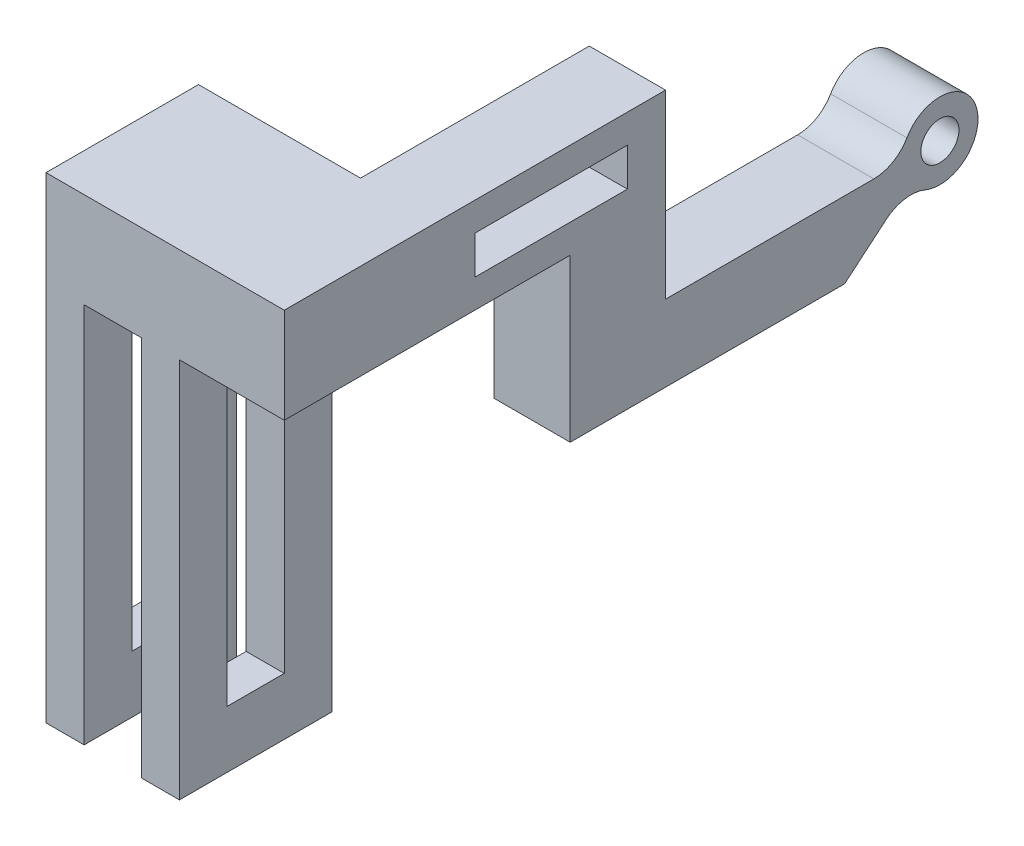
ISO-10303-21;
HEADER;
FILE_DESCRIPTION(('STEP AP214'),'2;1');
FILE_NAME('part.step','',(''),(''),'','','');
FILE_SCHEMA(('AUTOMOTIVE_DESIGN { 1 0 10303 214 1 1 1 1 }'));
ENDSEC;
DATA;
#1=APPLICATION_CONTEXT('core data for automotive mechanical design processes');
#2=APPLICATION_PROTOCOL_DEFINITION('international standard','automotive_design',2000,#1);
#3=PRODUCT_CONTEXT('',#1,'mechanical');
#4=PRODUCT('Part','Part','',(#3));
#5=PRODUCT_RELATED_PRODUCT_CATEGORY('part','',(#4));
#6=PRODUCT_DEFINITION_FORMATION('','',#4);
#7=PRODUCT_DEFINITION_CONTEXT('part definition',#1,'design');
#8=PRODUCT_DEFINITION('design','',#6,#7);
#9=PRODUCT_DEFINITION_SHAPE('','',#8);
#10=(LENGTH_UNIT() NAMED_UNIT(*) SI_UNIT(.MILLI.,.METRE.));
#11=(NAMED_UNIT(*) PLANE_ANGLE_UNIT() SI_UNIT($,.RADIAN.));
#12=(NAMED_UNIT(*) SI_UNIT($,.STERADIAN.) SOLID_ANGLE_UNIT());
#13=UNCERTAINTY_MEASURE_WITH_UNIT(LENGTH_MEASURE(1.E-05),#10,'distance_accuracy_value','');
#14=(GEOMETRIC_REPRESENTATION_CONTEXT(3) GLOBAL_UNCERTAINTY_ASSIGNED_CONTEXT((#13)) GLOBAL_UNIT_ASSIGNED_CONTEXT((#10,
#11,#12)) REPRESENTATION_CONTEXT('',''));
#15=CARTESIAN_POINT('',(0.,0.,0.));
#16=DIRECTION('',(0.,0.,1.));
#17=DIRECTION('',(1.,0.,0.));
#18=AXIS2_PLACEMENT_3D('',#15,#16,#17);
#19=CARTESIAN_POINT('',(22.6155281280883,7.32842712474617,0.));
#20=DIRECTION('',(0.,-1.,0.));
#21=DIRECTION('',(0.,0.,-1.));
#22=AXIS2_PLACEMENT_3D('',#19,#20,#21);
#23=PLANE('',#22);
#24=DIRECTION('',(0.,0.,1.));
#25=VECTOR('',#24,1.);
#26=CARTESIAN_POINT('',(-3.5,7.32842712474617,0.));
#27=LINE('',#26,#25);
#28=CARTESIAN_POINT('',(-3.5,7.32842712474617,29.2212425586298));
#29=VERTEX_POINT('',#28);
#30=CARTESIAN_POINT('',(-3.5,7.32842712474617,31.7212425586298));
#31=VERTEX_POINT('',#30);
#32=EDGE_CURVE('E267',#29,#31,#27,.T.);
#33=ORIENTED_EDGE('',*,*,#32,.F.);
#34=DIRECTION('',(1.,0.,0.));
#35=VECTOR('',#34,1.);
#36=CARTESIAN_POINT('',(-10.5,7.32842712474617,29.2212425586298));
#37=LINE('',#36,#35);
#38=CARTESIAN_POINT('',(-2.,7.32842712474617,29.2212425586298));
#39=VERTEX_POINT('',#38);
#40=EDGE_CURVE('E363',#29,#39,#37,.T.);
#41=ORIENTED_EDGE('',*,*,#40,.T.);
#42=DIRECTION('',(0.,0.,-1.));
#43=VECTOR('',#42,1.);
#44=CARTESIAN_POINT('',(-2.,7.32842712474617,0.));
#45=LINE('',#44,#43);
#46=CARTESIAN_POINT('',(-2.,7.32842712474617,22.2212425586298));
#47=VERTEX_POINT('',#46);
#48=EDGE_CURVE('E369',#39,#47,#45,.T.);
#49=ORIENTED_EDGE('',*,*,#48,.T.);
#50=DIRECTION('',(-1.,0.,0.));
#51=VECTOR('',#50,1.);
#52=CARTESIAN_POINT('',(22.6155281280883,7.32842712474617,22.2212425586298));
#53=LINE('',#52,#51);
#54=CARTESIAN_POINT('',(2.,7.32842712474617,22.2212425586298));
#55=VERTEX_POINT('',#54);
#56=EDGE_CURVE('E372',#55,#47,#53,.T.);
#57=ORIENTED_EDGE('',*,*,#56,.F.);
#58=DIRECTION('',(0.,0.,1.));
#59=VECTOR('',#58,1.);
#60=CARTESIAN_POINT('',(2.,7.32842712474617,0.));
#61=LINE('',#60,#59);
#62=CARTESIAN_POINT('',(2.,7.32842712474617,37.2212425586298));
#63=VERTEX_POINT('',#62);
#64=EDGE_CURVE('E375',#55,#63,#61,.T.);
#65=ORIENTED_EDGE('',*,*,#64,.T.);
#66=DIRECTION('',(-1.,0.,0.));
#67=VECTOR('',#66,1.);
#68=CARTESIAN_POINT('',(22.6155281280883,7.32842712474617,37.2212425586298));
#69=LINE('',#68,#67);
#70=CARTESIAN_POINT('',(-3.5,7.32842712474617,37.2212425586298));
#71=VERTEX_POINT('',#70);
#72=EDGE_CURVE('E385',#63,#71,#69,.T.);
#73=ORIENTED_EDGE('',*,*,#72,.T.);
#74=CARTESIAN_POINT('',(-3.5,7.32842712474617,34.7212425586298));
#75=VERTEX_POINT('',#74);
#76=EDGE_CURVE('E249',#75,#71,#27,.T.);
#77=ORIENTED_EDGE('',*,*,#76,.F.);
#78=DIRECTION('',(-1.,0.,0.));
#79=VECTOR('',#78,1.);
#80=CARTESIAN_POINT('',(-3.5,7.32842712474617,34.7212425586298));
#81=LINE('',#80,#79);
#82=CARTESIAN_POINT('',(-5.5,7.32842712474617,34.7212425586298));
#83=VERTEX_POINT('',#82);
#84=EDGE_CURVE('E261',#75,#83,#81,.T.);
#85=ORIENTED_EDGE('',*,*,#84,.T.);
#86=DIRECTION('',(0.,0.,1.));
#87=VECTOR('',#86,1.);
#88=CARTESIAN_POINT('',(-5.5,7.32842712474617,0.));
#89=LINE('',#88,#87);
#90=CARTESIAN_POINT('',(-5.5,7.32842712474617,37.2212425586298));
#91=VERTEX_POINT('',#90);
#92=EDGE_CURVE('E279',#83,#91,#89,.T.);
#93=ORIENTED_EDGE('',*,*,#92,.T.);
#94=CARTESIAN_POINT('',(-8.5,7.32842712474617,37.2212425586298));
#95=VERTEX_POINT('',#94);
#96=EDGE_CURVE('E378',#91,#95,#69,.T.);
#97=ORIENTED_EDGE('',*,*,#96,.T.);
#98=DIRECTION('',(0.,0.,1.));
#99=VECTOR('',#98,1.);
#100=CARTESIAN_POINT('',(-8.5,7.32842712474617,0.));
#101=LINE('',#100,#99);
#102=CARTESIAN_POINT('',(-8.5,7.32842712474617,34.7212425586298));
#103=VERTEX_POINT('',#102);
#104=EDGE_CURVE('E311',#103,#95,#101,.T.);
#105=ORIENTED_EDGE('',*,*,#104,.F.);
#106=DIRECTION('',(-1.,0.,0.));
#107=VECTOR('',#106,1.);
#108=CARTESIAN_POINT('',(-8.5,7.32842712474617,34.7212425586298));
#109=LINE('',#108,#107);
#110=CARTESIAN_POINT('',(-10.5,7.32842712474617,34.7212425586298));
#111=VERTEX_POINT('',#110);
#112=EDGE_CURVE('E342',#103,#111,#109,.T.);
#113=ORIENTED_EDGE('',*,*,#112,.T.);
#114=DIRECTION('',(0.,0.,1.));
#115=VECTOR('',#114,1.);
#116=CARTESIAN_POINT('',(-10.5,7.32842712474617,0.));
#117=LINE('',#116,#115);
#118=CARTESIAN_POINT('',(-10.5,7.32842712474617,31.7212425586298));
#119=VERTEX_POINT('',#118);
#120=EDGE_CURVE('E356',#119,#111,#117,.T.);
#121=ORIENTED_EDGE('',*,*,#120,.F.);
#122=DIRECTION('',(-1.,0.,0.));
#123=VECTOR('',#122,1.);
#124=CARTESIAN_POINT('',(-8.5,7.32842712474617,31.7212425586298));
#125=LINE('',#124,#123);
#126=CARTESIAN_POINT('',(-8.5,7.32842712474617,31.7212425586298));
#127=VERTEX_POINT('',#126);
#128=EDGE_CURVE('E333',#127,#119,#125,.T.);
#129=ORIENTED_EDGE('',*,*,#128,.F.);
#130=DIRECTION('',(0.,0.,1.));
#131=VECTOR('',#130,1.);
#132=CARTESIAN_POINT('',(-8.5,7.32842712474617,0.));
#133=LINE('',#132,#131);
#134=CARTESIAN_POINT('',(-8.5,7.32842712474617,29.2212425586298));
#135=VERTEX_POINT('',#134);
#136=EDGE_CURVE('E321',#135,#127,#133,.T.);
#137=ORIENTED_EDGE('',*,*,#136,.F.);
#138=CARTESIAN_POINT('',(-5.5,7.32842712474617,29.2212425586298));
#139=VERTEX_POINT('',#138);
#140=EDGE_CURVE('E360',#135,#139,#37,.T.);
#141=ORIENTED_EDGE('',*,*,#140,.T.);
#142=CARTESIAN_POINT('',(-5.5,7.32842712474617,31.7212425586298));
#143=VERTEX_POINT('',#142);
#144=EDGE_CURVE('E58',#139,#143,#89,.T.);
#145=ORIENTED_EDGE('',*,*,#144,.T.);
#146=DIRECTION('',(-1.,0.,0.));
#147=VECTOR('',#146,1.);
#148=CARTESIAN_POINT('',(-3.5,7.32842712474617,31.7212425586298));
#149=LINE('',#148,#147);
#150=EDGE_CURVE('E53',#31,#143,#149,.T.);
#151=ORIENTED_EDGE('',*,*,#150,.F.);
#152=EDGE_LOOP('',(#33,#41,#49,#57,#65,#73,#77,#85,#93,#97,#105,#113,#121,#129,#137,#141,#145,#151));
#153=FACE_BOUND('',#152,.T.);
#154=ADVANCED_FACE('F38',(#153),#23,.T.);
#155=CARTESIAN_POINT('',(-2.,-0.868489900777891,4.35577924733952));
#156=DIRECTION('',(1.,0.,0.));
#157=DIRECTION('',(0.,0.,-1.));
#158=AXIS2_PLACEMENT_3D('',#155,#156,#157);
#159=PLANE('',#158);
#160=DIRECTION('',(0.,0.,1.));
#161=VECTOR('',#160,1.);
#162=CARTESIAN_POINT('',(-2.,10.8284271247462,27.2212425586298));
#163=LINE('',#162,#161);
#164=CARTESIAN_POINT('',(-2.,10.8284271247462,19.2212425586298));
#165=VERTEX_POINT('',#164);
#166=CARTESIAN_POINT('',(-2.,10.8284271247462,27.2212425586298));
#167=VERTEX_POINT('',#166);
#168=EDGE_CURVE('E403',#165,#167,#163,.T.);
#169=ORIENTED_EDGE('',*,*,#168,.T.);
#170=DIRECTION('',(0.,-1.,0.));
#171=VECTOR('',#170,1.);
#172=CARTESIAN_POINT('',(-2.,8.82842712474617,27.2212425586298));
#173=LINE('',#172,#171);
#174=CARTESIAN_POINT('',(-2.,8.82842712474617,27.2212425586298));
#175=VERTEX_POINT('',#174);
#176=EDGE_CURVE('E399',#167,#175,#173,.T.);
#177=ORIENTED_EDGE('',*,*,#176,.T.);
#178=DIRECTION('',(0.,0.,1.));
#179=VECTOR('',#178,1.);
#180=CARTESIAN_POINT('',(-2.,8.82842712474617,27.2212425586298));
#181=LINE('',#180,#179);
#182=CARTESIAN_POINT('',(-2.,8.82842712474617,19.2212425586298));
#183=VERTEX_POINT('',#182);
#184=EDGE_CURVE('E406',#183,#175,#181,.T.);
#185=ORIENTED_EDGE('',*,*,#184,.F.);
#186=DIRECTION('',(0.,-1.,0.));
#187=VECTOR('',#186,1.);
#188=CARTESIAN_POINT('',(-2.,8.82842712474617,19.2212425586298));
#189=LINE('',#188,#187);
#190=EDGE_CURVE('E368',#165,#183,#189,.T.);
#191=ORIENTED_EDGE('',*,*,#190,.F.);
#192=EDGE_LOOP('',(#169,#177,#185,#191));
#193=FACE_BOUND('',#192,.T.);
#194=CARTESIAN_POINT('',(-2.,2.82842712474617,2.82842712474621));
#195=DIRECTION('',(1.,0.,0.));
#196=DIRECTION('',(0.,0.,-1.));
#197=AXIS2_PLACEMENT_3D('',#194,#195,#196);
#198=CIRCLE('',#197,1.);
#199=CARTESIAN_POINT('',(-2.,2.82842712474617,1.82842712474621));
#200=VERTEX_POINT('',#199);
#201=EDGE_CURVE('E454',#200,#200,#198,.T.);
#202=ORIENTED_EDGE('',*,*,#201,.T.);
#203=EDGE_LOOP('',(#202));
#204=FACE_BOUND('',#203,.T.);
#205=DIRECTION('',(0.,-1.,0.));
#206=VECTOR('',#205,1.);
#207=CARTESIAN_POINT('',(-2.,-0.868489900777891,29.2212425586298));
#208=LINE('',#207,#206);
#209=CARTESIAN_POINT('',(-2.00000000000001,12.3284271247462,29.2212425586298));
#210=VERTEX_POINT('',#209);
#211=EDGE_CURVE('E362',#210,#39,#208,.T.);
#212=ORIENTED_EDGE('',*,*,#211,.F.);
#213=DIRECTION('',(0.,0.,-1.));
#214=VECTOR('',#213,1.);
#215=CARTESIAN_POINT('',(-2.,12.3284271247462,0.));
#216=LINE('',#215,#214);
#217=CARTESIAN_POINT('',(-2.,12.3284271247462,17.2212425586298));
#218=VERTEX_POINT('',#217);
#219=EDGE_CURVE('E371',#210,#218,#216,.T.);
#220=ORIENTED_EDGE('',*,*,#219,.T.);
#221=DIRECTION('',(0.,1.,0.));
#222=VECTOR('',#221,1.);
#223=CARTESIAN_POINT('',(-2.,7.32842712474617,17.2212425586298));
#224=LINE('',#223,#222);
#225=CARTESIAN_POINT('',(-2.,2.82842712474617,17.2212425586298));
#226=VERTEX_POINT('',#225);
#227=EDGE_CURVE('E387',#226,#218,#224,.T.);
#228=ORIENTED_EDGE('',*,*,#227,.F.);
#229=DIRECTION('',(0.,0.,1.));
#230=VECTOR('',#229,1.);
#231=CARTESIAN_POINT('',(-2.,2.82842712474617,6.29252873988396));
#232=LINE('',#231,#230);
#233=CARTESIAN_POINT('',(-2.,2.82842712474617,6.29252873988396));
#234=VERTEX_POINT('',#233);
#235=EDGE_CURVE('E471',#234,#226,#232,.T.);
#236=ORIENTED_EDGE('',*,*,#235,.F.);
#237=CARTESIAN_POINT('',(-2.,4.82842712474617,6.29252873988396));
#238=DIRECTION('',(-1.,0.,0.));
#239=DIRECTION('',(0.,0.,-1.));
#240=AXIS2_PLACEMENT_3D('',#237,#238,#239);
#241=CIRCLE('',#240,2.);
#242=CARTESIAN_POINT('',(-2.,3.82842712474617,4.56047793231508));
#243=VERTEX_POINT('',#242);
#244=EDGE_CURVE('E468',#243,#234,#241,.T.);
#245=ORIENTED_EDGE('',*,*,#244,.F.);
#246=CARTESIAN_POINT('',(-2.,2.82842712474617,2.82842712474621));
#247=DIRECTION('',(1.,0.,0.));
#248=DIRECTION('',(0.,0.,-1.));
#249=AXIS2_PLACEMENT_3D('',#246,#247,#248);
#250=CIRCLE('',#249,2.);
#251=CARTESIAN_POINT('',(-2.,0.979968611984142,3.59210318604286));
#252=VERTEX_POINT('',#251);
#253=EDGE_CURVE('E465',#252,#243,#250,.T.);
#254=ORIENTED_EDGE('',*,*,#253,.F.);
#255=CARTESIAN_POINT('',(-2.,-0.868489900777891,4.35577924733952));
#256=DIRECTION('',(-1.,0.,0.));
#257=DIRECTION('',(0.,0.,-1.));
#258=AXIS2_PLACEMENT_3D('',#255,#256,#257);
#259=CIRCLE('',#258,2.);
#260=CARTESIAN_POINT('',(-2.,0.663598985460072,5.64135446671259));
#261=VERTEX_POINT('',#260);
#262=EDGE_CURVE('E462',#261,#252,#259,.T.);
#263=ORIENTED_EDGE('',*,*,#262,.F.);
#264=DIRECTION('',(0.,0.642787609686535,-0.766044443118981));
#265=VECTOR('',#264,1.);
#266=CARTESIAN_POINT('',(-2.,-1.17157287525383,7.8284271247462));
#267=LINE('',#266,#265);
#268=CARTESIAN_POINT('',(-2.,-1.17157287525383,7.8284271247462));
#269=VERTEX_POINT('',#268);
#270=EDGE_CURVE('E459',#269,#261,#267,.T.);
#271=ORIENTED_EDGE('',*,*,#270,.F.);
#272=DIRECTION('',(0.,0.,-1.));
#273=VECTOR('',#272,1.);
#274=CARTESIAN_POINT('',(-2.,-1.17157287525383,7.8284271247462));
#275=LINE('',#274,#273);
#276=CARTESIAN_POINT('',(-2.,-1.17157287525383,22.2212425586298));
#277=VERTEX_POINT('',#276);
#278=EDGE_CURVE('E457',#277,#269,#275,.T.);
#279=ORIENTED_EDGE('',*,*,#278,.F.);
#280=DIRECTION('',(0.,-1.,0.));
#281=VECTOR('',#280,1.);
#282=CARTESIAN_POINT('',(-2.,-0.868489900777891,22.2212425586298));
#283=LINE('',#282,#281);
#284=EDGE_CURVE('E432',#47,#277,#283,.T.);
#285=ORIENTED_EDGE('',*,*,#284,.F.);
#286=ORIENTED_EDGE('',*,*,#48,.F.);
#287=EDGE_LOOP('',(#212,#220,#228,#236,#245,#254,#263,#271,#279,#285,#286));
#288=FACE_BOUND('',#287,.T.);
#289=ADVANCED_FACE('F503',(#193,#204,#288),#159,.F.);
#290=CARTESIAN_POINT('',(-2.,2.82842712474617,6.29252873988396));
#291=DIRECTION('',(0.,1.,0.));
#292=DIRECTION('',(0.,0.,1.));
#293=AXIS2_PLACEMENT_3D('',#290,#291,#292);
#294=PLANE('',#293);
#295=DIRECTION('',(-1.,0.,0.));
#296=VECTOR('',#295,1.);
#297=CARTESIAN_POINT('',(22.6155281280883,2.82842712474617,17.2212425586298));
#298=LINE('',#297,#296);
#299=CARTESIAN_POINT('',(2.,2.82842712474617,17.2212425586298));
#300=VERTEX_POINT('',#299);
#301=EDGE_CURVE('E394',#300,#226,#298,.T.);
#302=ORIENTED_EDGE('',*,*,#301,.F.);
#303=DIRECTION('',(0.,0.,1.));
#304=VECTOR('',#303,1.);
#305=CARTESIAN_POINT('',(2.,2.82842712474617,6.29252873988396));
#306=LINE('',#305,#304);
#307=CARTESIAN_POINT('',(2.,2.82842712474617,6.29252873988396));
#308=VERTEX_POINT('',#307);
#309=EDGE_CURVE('E451',#308,#300,#306,.T.);
#310=ORIENTED_EDGE('',*,*,#309,.F.);
#311=DIRECTION('',(1.,0.,0.));
#312=VECTOR('',#311,1.);
#313=CARTESIAN_POINT('',(-2.,2.82842712474617,6.29252873988396));
#314=LINE('',#313,#312);
#315=EDGE_CURVE('E46',#234,#308,#314,.T.);
#316=ORIENTED_EDGE('',*,*,#315,.F.);
#317=ORIENTED_EDGE('',*,*,#235,.T.);
#318=EDGE_LOOP('',(#302,#310,#316,#317));
#319=FACE_BOUND('',#318,.T.);
#320=ADVANCED_FACE('F511',(#319),#294,.T.);
#321=CARTESIAN_POINT('',(-2.,-1.17157287525383,7.8284271247462));
#322=DIRECTION('',(0.,-1.,0.));
#323=DIRECTION('',(0.,0.,-1.));
#324=AXIS2_PLACEMENT_3D('',#321,#322,#323);
#325=PLANE('',#324);
#326=DIRECTION('',(0.,0.,-1.));
#327=VECTOR('',#326,1.);
#328=CARTESIAN_POINT('',(2.,-1.17157287525383,7.8284271247462));
#329=LINE('',#328,#327);
#330=CARTESIAN_POINT('',(2.,-1.17157287525383,22.2212425586298));
#331=VERTEX_POINT('',#330);
#332=CARTESIAN_POINT('',(2.,-1.17157287525383,7.8284271247462));
#333=VERTEX_POINT('',#332);
#334=EDGE_CURVE('E437',#331,#333,#329,.T.);
#335=ORIENTED_EDGE('',*,*,#334,.F.);
#336=DIRECTION('',(-1.,0.,0.));
#337=VECTOR('',#336,1.);
#338=CARTESIAN_POINT('',(-2.,-1.17157287525383,22.2212425586298));
#339=LINE('',#338,#337);
#340=EDGE_CURVE('E384',#331,#277,#339,.T.);
#341=ORIENTED_EDGE('',*,*,#340,.T.);
#342=ORIENTED_EDGE('',*,*,#278,.T.);
#343=DIRECTION('',(1.,0.,0.));
#344=VECTOR('',#343,1.);
#345=CARTESIAN_POINT('',(-2.,-1.17157287525383,7.8284271247462));
#346=LINE('',#345,#344);
#347=EDGE_CURVE('E473',#269,#333,#346,.T.);
#348=ORIENTED_EDGE('',*,*,#347,.T.);
#349=EDGE_LOOP('',(#335,#341,#342,#348));
#350=FACE_BOUND('',#349,.T.);
#351=ADVANCED_FACE('F40',(#350),#325,.T.);
#352=CARTESIAN_POINT('',(2.,-0.868489900777891,4.35577924733952));
#353=DIRECTION('',(1.,0.,0.));
#354=DIRECTION('',(0.,0.,-1.));
#355=AXIS2_PLACEMENT_3D('',#352,#353,#354);
#356=PLANE('',#355);
#357=CARTESIAN_POINT('',(2.,2.82842712474617,2.82842712474621));
#358=DIRECTION('',(1.,0.,0.));
#359=DIRECTION('',(0.,0.,-1.));
#360=AXIS2_PLACEMENT_3D('',#357,#358,#359);
#361=CIRCLE('',#360,1.);
#362=CARTESIAN_POINT('',(2.,2.82842712474617,1.82842712474621));
#363=VERTEX_POINT('',#362);
#364=EDGE_CURVE('E434',#363,#363,#361,.T.);
#365=ORIENTED_EDGE('',*,*,#364,.F.);
#366=EDGE_LOOP('',(#365));
#367=FACE_BOUND('',#366,.T.);
#368=ORIENTED_EDGE('',*,*,#309,.T.);
#369=DIRECTION('',(0.,-1.,0.));
#370=VECTOR('',#369,1.);
#371=CARTESIAN_POINT('',(2.,7.32842712474617,17.2212425586298));
#372=LINE('',#371,#370);
#373=CARTESIAN_POINT('',(2.,12.3284271247462,17.2212425586298));
#374=VERTEX_POINT('',#373);
#375=EDGE_CURVE('E390',#374,#300,#372,.T.);
#376=ORIENTED_EDGE('',*,*,#375,.F.);
#377=DIRECTION('',(0.,0.,1.));
#378=VECTOR('',#377,1.);
#379=CARTESIAN_POINT('',(2.,12.3284271247462,0.));
#380=LINE('',#379,#378);
#381=CARTESIAN_POINT('',(2.,12.3284271247462,37.2212425586298));
#382=VERTEX_POINT('',#381);
#383=EDGE_CURVE('E374',#374,#382,#380,.T.);
#384=ORIENTED_EDGE('',*,*,#383,.T.);
#385=DIRECTION('',(0.,-1.,0.));
#386=VECTOR('',#385,1.);
#387=CARTESIAN_POINT('',(2.,0.,37.2212425586298));
#388=LINE('',#387,#386);
#389=EDGE_CURVE('E379',#382,#63,#388,.T.);
#390=ORIENTED_EDGE('',*,*,#389,.T.);
#391=ORIENTED_EDGE('',*,*,#64,.F.);
#392=DIRECTION('',(0.,-1.,0.));
#393=VECTOR('',#392,1.);
#394=CARTESIAN_POINT('',(2.,-0.868489900777891,22.2212425586298));
#395=LINE('',#394,#393);
#396=EDGE_CURVE('E11',#55,#331,#395,.T.);
#397=ORIENTED_EDGE('',*,*,#396,.T.);
#398=ORIENTED_EDGE('',*,*,#334,.T.);
#399=DIRECTION('',(0.,0.642787609686535,-0.766044443118981));
#400=VECTOR('',#399,1.);
#401=CARTESIAN_POINT('',(2.,-1.17157287525383,7.8284271247462));
#402=LINE('',#401,#400);
#403=CARTESIAN_POINT('',(2.,0.663598985460072,5.64135446671259));
#404=VERTEX_POINT('',#403);
#405=EDGE_CURVE('E439',#333,#404,#402,.T.);
#406=ORIENTED_EDGE('',*,*,#405,.T.);
#407=CARTESIAN_POINT('',(2.,-0.868489900777891,4.35577924733952));
#408=DIRECTION('',(-1.,0.,0.));
#409=DIRECTION('',(0.,0.,-1.));
#410=AXIS2_PLACEMENT_3D('',#407,#408,#409);
#411=CIRCLE('',#410,2.);
#412=CARTESIAN_POINT('',(2.,0.979968611984142,3.59210318604286));
#413=VERTEX_POINT('',#412);
#414=EDGE_CURVE('E442',#404,#413,#411,.T.);
#415=ORIENTED_EDGE('',*,*,#414,.T.);
#416=CARTESIAN_POINT('',(2.,2.82842712474617,2.82842712474621));
#417=DIRECTION('',(1.,0.,0.));
#418=DIRECTION('',(0.,0.,-1.));
#419=AXIS2_PLACEMENT_3D('',#416,#417,#418);
#420=CIRCLE('',#419,2.);
#421=CARTESIAN_POINT('',(2.,3.82842712474617,4.56047793231508));
#422=VERTEX_POINT('',#421);
#423=EDGE_CURVE('E445',#413,#422,#420,.T.);
#424=ORIENTED_EDGE('',*,*,#423,.T.);
#425=CARTESIAN_POINT('',(2.,4.82842712474617,6.29252873988396));
#426=DIRECTION('',(-1.,0.,0.));
#427=DIRECTION('',(0.,0.,-1.));
#428=AXIS2_PLACEMENT_3D('',#425,#426,#427);
#429=CIRCLE('',#428,2.);
#430=EDGE_CURVE('E448',#422,#308,#429,.T.);
#431=ORIENTED_EDGE('',*,*,#430,.T.);
#432=EDGE_LOOP('',(#368,#376,#384,#390,#391,#397,#398,#406,#415,#424,#431));
#433=FACE_BOUND('',#432,.T.);
#434=DIRECTION('',(0.,1.,0.));
#435=VECTOR('',#434,1.);
#436=CARTESIAN_POINT('',(2.,8.82842712474617,27.2212425586298));
#437=LINE('',#436,#435);
#438=CARTESIAN_POINT('',(2.,8.82842712474617,27.2212425586298));
#439=VERTEX_POINT('',#438);
#440=CARTESIAN_POINT('',(2.,10.8284271247462,27.2212425586298));
#441=VERTEX_POINT('',#440);
#442=EDGE_CURVE('E413',#439,#441,#437,.T.);
#443=ORIENTED_EDGE('',*,*,#442,.T.);
#444=DIRECTION('',(0.,0.,-1.));
#445=VECTOR('',#444,1.);
#446=CARTESIAN_POINT('',(2.,10.8284271247462,27.2212425586298));
#447=LINE('',#446,#445);
#448=CARTESIAN_POINT('',(2.,10.8284271247462,19.2212425586298));
#449=VERTEX_POINT('',#448);
#450=EDGE_CURVE('E415',#441,#449,#447,.T.);
#451=ORIENTED_EDGE('',*,*,#450,.T.);
#452=DIRECTION('',(0.,1.,0.));
#453=VECTOR('',#452,1.);
#454=CARTESIAN_POINT('',(2.,8.82842712474617,19.2212425586298));
#455=LINE('',#454,#453);
#456=CARTESIAN_POINT('',(2.,8.82842712474617,19.2212425586298));
#457=VERTEX_POINT('',#456);
#458=EDGE_CURVE('E391',#457,#449,#455,.T.);
#459=ORIENTED_EDGE('',*,*,#458,.F.);
#460=DIRECTION('',(0.,0.,-1.));
#461=VECTOR('',#460,1.);
#462=CARTESIAN_POINT('',(2.,8.82842712474617,27.2212425586298));
#463=LINE('',#462,#461);
#464=EDGE_CURVE('E402',#439,#457,#463,.T.);
#465=ORIENTED_EDGE('',*,*,#464,.F.);
#466=EDGE_LOOP('',(#443,#451,#459,#465));
#467=FACE_BOUND('',#466,.T.);
#468=ADVANCED_FACE('F491',(#367,#433,#467),#356,.T.);
#469=CARTESIAN_POINT('',(-2.,4.82842712474617,6.29252873988396));
#470=DIRECTION('',(1.,0.,0.));
#471=DIRECTION('',(0.,0.,-1.));
#472=AXIS2_PLACEMENT_3D('',#469,#470,#471);
#473=CYLINDRICAL_SURFACE('',#472,2.);
#474=ORIENTED_EDGE('',*,*,#315,.T.);
#475=ORIENTED_EDGE('',*,*,#430,.F.);
#476=DIRECTION('',(1.,0.,0.));
#477=VECTOR('',#476,1.);
#478=CARTESIAN_POINT('',(-2.,3.82842712474617,4.56047793231508));
#479=LINE('',#478,#477);
#480=EDGE_CURVE('E475',#243,#422,#479,.T.);
#481=ORIENTED_EDGE('',*,*,#480,.F.);
#482=ORIENTED_EDGE('',*,*,#244,.T.);
#483=EDGE_LOOP('',(#474,#475,#481,#482));
#484=FACE_BOUND('',#483,.T.);
#485=ADVANCED_FACE('F507',(#484),#473,.F.);
#486=CARTESIAN_POINT('',(-2.,2.82842712474617,2.82842712474621));
#487=DIRECTION('',(1.,0.,0.));
#488=DIRECTION('',(0.,0.,-1.));
#489=AXIS2_PLACEMENT_3D('',#486,#487,#488);
#490=CYLINDRICAL_SURFACE('',#489,2.);
#491=ORIENTED_EDGE('',*,*,#480,.T.);
#492=ORIENTED_EDGE('',*,*,#423,.F.);
#493=DIRECTION('',(1.,0.,0.));
#494=VECTOR('',#493,1.);
#495=CARTESIAN_POINT('',(-2.,0.979968611984142,3.59210318604286));
#496=LINE('',#495,#494);
#497=EDGE_CURVE('E477',#252,#413,#496,.T.);
#498=ORIENTED_EDGE('',*,*,#497,.F.);
#499=ORIENTED_EDGE('',*,*,#253,.T.);
#500=EDGE_LOOP('',(#491,#492,#498,#499));
#501=FACE_BOUND('',#500,.T.);
#502=ADVANCED_FACE('F499',(#501),#490,.T.);
#503=CARTESIAN_POINT('',(-2.,-0.868489900777891,4.35577924733952));
#504=DIRECTION('',(1.,0.,0.));
#505=DIRECTION('',(0.,0.,-1.));
#506=AXIS2_PLACEMENT_3D('',#503,#504,#505);
#507=CYLINDRICAL_SURFACE('',#506,2.);
#508=ORIENTED_EDGE('',*,*,#497,.T.);
#509=ORIENTED_EDGE('',*,*,#414,.F.);
#510=DIRECTION('',(1.,0.,0.));
#511=VECTOR('',#510,1.);
#512=CARTESIAN_POINT('',(-2.,0.663598985460072,5.64135446671259));
#513=LINE('',#512,#511);
#514=EDGE_CURVE('E479',#261,#404,#513,.T.);
#515=ORIENTED_EDGE('',*,*,#514,.F.);
#516=ORIENTED_EDGE('',*,*,#262,.T.);
#517=EDGE_LOOP('',(#508,#509,#515,#516));
#518=FACE_BOUND('',#517,.T.);
#519=ADVANCED_FACE('F495',(#518),#507,.F.);
#520=CARTESIAN_POINT('',(-2.,-1.17157287525383,7.8284271247462));
#521=DIRECTION('',(0.,-0.766044443118982,-0.642787609686535));
#522=DIRECTION('',(0.,0.642787609686535,-0.766044443118981));
#523=AXIS2_PLACEMENT_3D('',#520,#521,#522);
#524=PLANE('',#523);
#525=ORIENTED_EDGE('',*,*,#514,.T.);
#526=ORIENTED_EDGE('',*,*,#405,.F.);
#527=ORIENTED_EDGE('',*,*,#347,.F.);
#528=ORIENTED_EDGE('',*,*,#270,.T.);
#529=EDGE_LOOP('',(#525,#526,#527,#528));
#530=FACE_BOUND('',#529,.T.);
#531=ADVANCED_FACE('F488',(#530),#524,.T.);
#532=CARTESIAN_POINT('',(-2.,2.82842712474617,2.82842712474621));
#533=DIRECTION('',(1.,0.,0.));
#534=DIRECTION('',(0.,0.,-1.));
#535=AXIS2_PLACEMENT_3D('',#532,#533,#534);
#536=CYLINDRICAL_SURFACE('',#535,1.);
#537=ORIENTED_EDGE('',*,*,#201,.F.);
#538=EDGE_LOOP('',(#537));
#539=FACE_BOUND('',#538,.T.);
#540=ORIENTED_EDGE('',*,*,#364,.T.);
#541=EDGE_LOOP('',(#540));
#542=FACE_BOUND('',#541,.T.);
#543=ADVANCED_FACE('F617',(#539,#542),#536,.F.);
#544=CARTESIAN_POINT('',(0.,0.,22.2212425586298));
#545=DIRECTION('',(0.,0.,1.));
#546=DIRECTION('',(1.,0.,0.));
#547=AXIS2_PLACEMENT_3D('',#544,#545,#546);
#548=PLANE('',#547);
#549=ORIENTED_EDGE('',*,*,#284,.T.);
#550=ORIENTED_EDGE('',*,*,#340,.F.);
#551=ORIENTED_EDGE('',*,*,#396,.F.);
#552=ORIENTED_EDGE('',*,*,#56,.T.);
#553=EDGE_LOOP('',(#549,#550,#551,#552));
#554=FACE_BOUND('',#553,.T.);
#555=ADVANCED_FACE('F526',(#554),#548,.T.);
#556=CARTESIAN_POINT('',(22.6155281280883,0.,37.2212425586298));
#557=DIRECTION('',(0.,0.,-1.));
#558=DIRECTION('',(-1.,0.,0.));
#559=AXIS2_PLACEMENT_3D('',#556,#557,#558);
#560=PLANE('',#559);
#561=DIRECTION('',(-1.,0.,0.));
#562=VECTOR('',#561,1.);
#563=CARTESIAN_POINT('',(22.6155281280883,12.3284271247462,37.2212425586298));
#564=LINE('',#563,#562);
#565=CARTESIAN_POINT('',(-10.5,12.3284271247462,37.2212425586298));
#566=VERTEX_POINT('',#565);
#567=EDGE_CURVE('E382',#382,#566,#564,.T.);
#568=ORIENTED_EDGE('',*,*,#567,.T.);
#569=DIRECTION('',(0.,-1.,0.));
#570=VECTOR('',#569,1.);
#571=CARTESIAN_POINT('',(-10.5,0.,37.2212425586298));
#572=LINE('',#571,#570);
#573=CARTESIAN_POINT('',(-10.5,-12.6715728752538,37.2212425586298));
#574=VERTEX_POINT('',#573);
#575=EDGE_CURVE('E354',#566,#574,#572,.T.);
#576=ORIENTED_EDGE('',*,*,#575,.T.);
#577=DIRECTION('',(-1.,0.,0.));
#578=VECTOR('',#577,1.);
#579=CARTESIAN_POINT('',(-8.5,-12.6715728752538,37.2212425586298));
#580=LINE('',#579,#578);
#581=CARTESIAN_POINT('',(-8.5,-12.6715728752538,37.2212425586298));
#582=VERTEX_POINT('',#581);
#583=EDGE_CURVE('E345',#582,#574,#580,.T.);
#584=ORIENTED_EDGE('',*,*,#583,.F.);
#585=DIRECTION('',(0.,-1.,0.));
#586=VECTOR('',#585,1.);
#587=CARTESIAN_POINT('',(-8.5,0.,37.2212425586298));
#588=LINE('',#587,#586);
#589=EDGE_CURVE('E309',#95,#582,#588,.T.);
#590=ORIENTED_EDGE('',*,*,#589,.F.);
#591=ORIENTED_EDGE('',*,*,#96,.F.);
#592=DIRECTION('',(0.,-1.,0.));
#593=VECTOR('',#592,1.);
#594=CARTESIAN_POINT('',(-5.5,0.,37.2212425586298));
#595=LINE('',#594,#593);
#596=CARTESIAN_POINT('',(-5.5,-12.6715728752538,37.2212425586298));
#597=VERTEX_POINT('',#596);
#598=EDGE_CURVE('E257',#91,#597,#595,.T.);
#599=ORIENTED_EDGE('',*,*,#598,.T.);
#600=DIRECTION('',(-1.,0.,0.));
#601=VECTOR('',#600,1.);
#602=CARTESIAN_POINT('',(-3.5,-12.6715728752538,37.2212425586298));
#603=LINE('',#602,#601);
#604=CARTESIAN_POINT('',(-3.5,-12.6715728752538,37.2212425586298));
#605=VERTEX_POINT('',#604);
#606=EDGE_CURVE('E254',#605,#597,#603,.T.);
#607=ORIENTED_EDGE('',*,*,#606,.F.);
#608=DIRECTION('',(0.,-1.,0.));
#609=VECTOR('',#608,1.);
#610=CARTESIAN_POINT('',(-3.5,0.,37.2212425586298));
#611=LINE('',#610,#609);
#612=EDGE_CURVE('E241',#71,#605,#611,.T.);
#613=ORIENTED_EDGE('',*,*,#612,.F.);
#614=ORIENTED_EDGE('',*,*,#72,.F.);
#615=ORIENTED_EDGE('',*,*,#389,.F.);
#616=EDGE_LOOP('',(#568,#576,#584,#590,#591,#599,#607,#613,#614,#615));
#617=FACE_BOUND('',#616,.T.);
#618=ADVANCED_FACE('F255',(#617),#560,.F.);
#619=CARTESIAN_POINT('',(22.6155281280883,12.3284271247462,0.));
#620=DIRECTION('',(0.,-1.,0.));
#621=DIRECTION('',(0.,0.,-1.));
#622=AXIS2_PLACEMENT_3D('',#619,#620,#621);
#623=PLANE('',#622);
#624=ORIENTED_EDGE('',*,*,#219,.F.);
#625=DIRECTION('',(1.,0.,0.));
#626=VECTOR('',#625,1.);
#627=CARTESIAN_POINT('',(-10.5,12.3284271247462,29.2212425586298));
#628=LINE('',#627,#626);
#629=CARTESIAN_POINT('',(-10.5,12.3284271247462,29.2212425586298));
#630=VERTEX_POINT('',#629);
#631=EDGE_CURVE('E359',#630,#210,#628,.T.);
#632=ORIENTED_EDGE('',*,*,#631,.F.);
#633=DIRECTION('',(0.,0.,1.));
#634=VECTOR('',#633,1.);
#635=CARTESIAN_POINT('',(-10.5,12.3284271247462,0.));
#636=LINE('',#635,#634);
#637=EDGE_CURVE('E351',#630,#566,#636,.T.);
#638=ORIENTED_EDGE('',*,*,#637,.T.);
#639=ORIENTED_EDGE('',*,*,#567,.F.);
#640=ORIENTED_EDGE('',*,*,#383,.F.);
#641=DIRECTION('',(-1.,0.,0.));
#642=VECTOR('',#641,1.);
#643=CARTESIAN_POINT('',(22.6155281280883,12.3284271247462,17.2212425586298));
#644=LINE('',#643,#642);
#645=EDGE_CURVE('E420',#374,#218,#644,.T.);
#646=ORIENTED_EDGE('',*,*,#645,.T.);
#647=EDGE_LOOP('',(#624,#632,#638,#639,#640,#646));
#648=FACE_BOUND('',#647,.T.);
#649=ADVANCED_FACE('F517',(#648),#623,.F.);
#650=CARTESIAN_POINT('',(22.6155281280883,7.32842712474617,17.2212425586298));
#651=DIRECTION('',(0.,0.,-1.));
#652=DIRECTION('',(-1.,0.,0.));
#653=AXIS2_PLACEMENT_3D('',#650,#651,#652);
#654=PLANE('',#653);
#655=ORIENTED_EDGE('',*,*,#227,.T.);
#656=ORIENTED_EDGE('',*,*,#645,.F.);
#657=ORIENTED_EDGE('',*,*,#375,.T.);
#658=ORIENTED_EDGE('',*,*,#301,.T.);
#659=EDGE_LOOP('',(#655,#656,#657,#658));
#660=FACE_BOUND('',#659,.T.);
#661=ADVANCED_FACE('F513',(#660),#654,.T.);
#662=CARTESIAN_POINT('',(22.6155281280883,8.82842712474617,19.2212425586298));
#663=DIRECTION('',(0.,0.,1.));
#664=DIRECTION('',(1.,0.,0.));
#665=AXIS2_PLACEMENT_3D('',#662,#663,#664);
#666=PLANE('',#665);
#667=DIRECTION('',(-1.,0.,0.));
#668=VECTOR('',#667,1.);
#669=CARTESIAN_POINT('',(22.6155281280883,8.82842712474617,19.2212425586298));
#670=LINE('',#669,#668);
#671=EDGE_CURVE('E423',#457,#183,#670,.T.);
#672=ORIENTED_EDGE('',*,*,#671,.F.);
#673=ORIENTED_EDGE('',*,*,#458,.T.);
#674=DIRECTION('',(-1.,0.,0.));
#675=VECTOR('',#674,1.);
#676=CARTESIAN_POINT('',(22.6155281280883,10.8284271247462,19.2212425586298));
#677=LINE('',#676,#675);
#678=EDGE_CURVE('E417',#449,#165,#677,.T.);
#679=ORIENTED_EDGE('',*,*,#678,.T.);
#680=ORIENTED_EDGE('',*,*,#190,.T.);
#681=EDGE_LOOP('',(#672,#673,#679,#680));
#682=FACE_BOUND('',#681,.T.);
#683=ADVANCED_FACE('F599',(#682),#666,.T.);
#684=CARTESIAN_POINT('',(22.6155281280883,8.82842712474617,27.2212425586298));
#685=DIRECTION('',(0.,1.,0.));
#686=DIRECTION('',(0.,0.,1.));
#687=AXIS2_PLACEMENT_3D('',#684,#685,#686);
#688=PLANE('',#687);
#689=DIRECTION('',(-1.,0.,0.));
#690=VECTOR('',#689,1.);
#691=CARTESIAN_POINT('',(22.6155281280883,8.82842712474617,27.2212425586298));
#692=LINE('',#691,#690);
#693=EDGE_CURVE('E421',#439,#175,#692,.T.);
#694=ORIENTED_EDGE('',*,*,#693,.F.);
#695=ORIENTED_EDGE('',*,*,#464,.T.);
#696=ORIENTED_EDGE('',*,*,#671,.T.);
#697=ORIENTED_EDGE('',*,*,#184,.T.);
#698=EDGE_LOOP('',(#694,#695,#696,#697));
#699=FACE_BOUND('',#698,.T.);
#700=ADVANCED_FACE('F604',(#699),#688,.T.);
#701=CARTESIAN_POINT('',(22.6155281280883,8.82842712474617,27.2212425586298));
#702=DIRECTION('',(0.,0.,1.));
#703=DIRECTION('',(1.,0.,0.));
#704=AXIS2_PLACEMENT_3D('',#701,#702,#703);
#705=PLANE('',#704);
#706=ORIENTED_EDGE('',*,*,#442,.F.);
#707=ORIENTED_EDGE('',*,*,#693,.T.);
#708=ORIENTED_EDGE('',*,*,#176,.F.);
#709=DIRECTION('',(-1.,0.,0.));
#710=VECTOR('',#709,1.);
#711=CARTESIAN_POINT('',(22.6155281280883,10.8284271247462,27.2212425586298));
#712=LINE('',#711,#710);
#713=EDGE_CURVE('E418',#441,#167,#712,.T.);
#714=ORIENTED_EDGE('',*,*,#713,.F.);
#715=EDGE_LOOP('',(#706,#707,#708,#714));
#716=FACE_BOUND('',#715,.T.);
#717=ADVANCED_FACE('F600',(#716),#705,.F.);
#718=CARTESIAN_POINT('',(22.6155281280883,10.8284271247462,27.2212425586298));
#719=DIRECTION('',(0.,1.,0.));
#720=DIRECTION('',(0.,0.,1.));
#721=AXIS2_PLACEMENT_3D('',#718,#719,#720);
#722=PLANE('',#721);
#723=ORIENTED_EDGE('',*,*,#450,.F.);
#724=ORIENTED_EDGE('',*,*,#713,.T.);
#725=ORIENTED_EDGE('',*,*,#168,.F.);
#726=ORIENTED_EDGE('',*,*,#678,.F.);
#727=EDGE_LOOP('',(#723,#724,#725,#726));
#728=FACE_BOUND('',#727,.T.);
#729=ADVANCED_FACE('F603',(#728),#722,.F.);
#730=CARTESIAN_POINT('',(-10.5,0.,29.2212425586298));
#731=DIRECTION('',(0.,0.,1.));
#732=DIRECTION('',(1.,0.,0.));
#733=AXIS2_PLACEMENT_3D('',#730,#731,#732);
#734=PLANE('',#733);
#735=ORIENTED_EDGE('',*,*,#631,.T.);
#736=ORIENTED_EDGE('',*,*,#211,.T.);
#737=ORIENTED_EDGE('',*,*,#40,.F.);
#738=DIRECTION('',(0.,-1.,0.));
#739=VECTOR('',#738,1.);
#740=CARTESIAN_POINT('',(-3.5,0.,29.2212425586298));
#741=LINE('',#740,#739);
#742=CARTESIAN_POINT('',(-3.5,-12.6715728752538,29.2212425586298));
#743=VERTEX_POINT('',#742);
#744=EDGE_CURVE('E265',#29,#743,#741,.T.);
#745=ORIENTED_EDGE('',*,*,#744,.T.);
#746=DIRECTION('',(-1.,0.,0.));
#747=VECTOR('',#746,1.);
#748=CARTESIAN_POINT('',(-3.5,-12.6715728752538,29.2212425586298));
#749=LINE('',#748,#747);
#750=CARTESIAN_POINT('',(-5.5,-12.6715728752538,29.2212425586298));
#751=VERTEX_POINT('',#750);
#752=EDGE_CURVE('E262',#743,#751,#749,.T.);
#753=ORIENTED_EDGE('',*,*,#752,.T.);
#754=DIRECTION('',(0.,-1.,0.));
#755=VECTOR('',#754,1.);
#756=CARTESIAN_POINT('',(-5.5,0.,29.2212425586298));
#757=LINE('',#756,#755);
#758=EDGE_CURVE('E285',#139,#751,#757,.T.);
#759=ORIENTED_EDGE('',*,*,#758,.F.);
#760=ORIENTED_EDGE('',*,*,#140,.F.);
#761=DIRECTION('',(0.,-1.,0.));
#762=VECTOR('',#761,1.);
#763=CARTESIAN_POINT('',(-8.5,0.,29.2212425586298));
#764=LINE('',#763,#762);
#765=CARTESIAN_POINT('',(-8.5,-12.6715728752538,29.2212425586298));
#766=VERTEX_POINT('',#765);
#767=EDGE_CURVE('E302',#135,#766,#764,.T.);
#768=ORIENTED_EDGE('',*,*,#767,.T.);
#769=DIRECTION('',(-1.,0.,0.));
#770=VECTOR('',#769,1.);
#771=CARTESIAN_POINT('',(-8.5,-12.6715728752538,29.2212425586298));
#772=LINE('',#771,#770);
#773=CARTESIAN_POINT('',(-10.5,-12.6715728752538,29.2212425586298));
#774=VERTEX_POINT('',#773);
#775=EDGE_CURVE('E323',#766,#774,#772,.T.);
#776=ORIENTED_EDGE('',*,*,#775,.T.);
#777=DIRECTION('',(0.,-1.,0.));
#778=VECTOR('',#777,1.);
#779=CARTESIAN_POINT('',(-10.5,0.,29.2212425586298));
#780=LINE('',#779,#778);
#781=EDGE_CURVE('E336',#630,#774,#780,.T.);
#782=ORIENTED_EDGE('',*,*,#781,.F.);
#783=EDGE_LOOP('',(#735,#736,#737,#745,#753,#759,#760,#768,#776,#782));
#784=FACE_BOUND('',#783,.T.);
#785=ADVANCED_FACE('F528',(#784),#734,.F.);
#786=CARTESIAN_POINT('',(-10.5,0.,0.));
#787=DIRECTION('',(1.,0.,0.));
#788=DIRECTION('',(0.,0.,-1.));
#789=AXIS2_PLACEMENT_3D('',#786,#787,#788);
#790=PLANE('',#789);
#791=DIRECTION('',(0.,-1.,0.));
#792=VECTOR('',#791,1.);
#793=CARTESIAN_POINT('',(-10.5,0.,31.7212425586298));
#794=LINE('',#793,#792);
#795=CARTESIAN_POINT('',(-10.5,-9.67157287525383,31.7212425586298));
#796=VERTEX_POINT('',#795);
#797=EDGE_CURVE('E306',#119,#796,#794,.T.);
#798=ORIENTED_EDGE('',*,*,#797,.F.);
#799=ORIENTED_EDGE('',*,*,#120,.T.);
#800=DIRECTION('',(0.,-1.,0.));
#801=VECTOR('',#800,1.);
#802=CARTESIAN_POINT('',(-10.5,0.,34.7212425586298));
#803=LINE('',#802,#801);
#804=CARTESIAN_POINT('',(-10.5,-9.67157287525383,34.7212425586298));
#805=VERTEX_POINT('',#804);
#806=EDGE_CURVE('E326',#111,#805,#803,.T.);
#807=ORIENTED_EDGE('',*,*,#806,.T.);
#808=DIRECTION('',(0.,0.,1.));
#809=VECTOR('',#808,1.);
#810=CARTESIAN_POINT('',(-10.5,-9.67157287525383,0.));
#811=LINE('',#810,#809);
#812=EDGE_CURVE('E329',#796,#805,#811,.T.);
#813=ORIENTED_EDGE('',*,*,#812,.F.);
#814=EDGE_LOOP('',(#798,#799,#807,#813));
#815=FACE_BOUND('',#814,.T.);
#816=ORIENTED_EDGE('',*,*,#781,.T.);
#817=DIRECTION('',(0.,0.,1.));
#818=VECTOR('',#817,1.);
#819=CARTESIAN_POINT('',(-10.5,-12.6715728752538,0.));
#820=LINE('',#819,#818);
#821=EDGE_CURVE('E301',#774,#574,#820,.T.);
#822=ORIENTED_EDGE('',*,*,#821,.T.);
#823=ORIENTED_EDGE('',*,*,#575,.F.);
#824=ORIENTED_EDGE('',*,*,#637,.F.);
#825=EDGE_LOOP('',(#816,#822,#823,#824));
#826=FACE_BOUND('',#825,.T.);
#827=ADVANCED_FACE('F533',(#815,#826),#790,.F.);
#828=CARTESIAN_POINT('',(-8.5,0.,31.7212425586298));
#829=DIRECTION('',(0.,0.,-1.));
#830=DIRECTION('',(-1.,0.,0.));
#831=AXIS2_PLACEMENT_3D('',#828,#829,#830);
#832=PLANE('',#831);
#833=ORIENTED_EDGE('',*,*,#797,.T.);
#834=DIRECTION('',(-1.,0.,0.));
#835=VECTOR('',#834,1.);
#836=CARTESIAN_POINT('',(-8.5,-9.67157287525383,31.7212425586298));
#837=LINE('',#836,#835);
#838=CARTESIAN_POINT('',(-8.5,-9.67157287525383,31.7212425586298));
#839=VERTEX_POINT('',#838);
#840=EDGE_CURVE('E337',#839,#796,#837,.T.);
#841=ORIENTED_EDGE('',*,*,#840,.F.);
#842=DIRECTION('',(0.,-1.,0.));
#843=VECTOR('',#842,1.);
#844=CARTESIAN_POINT('',(-8.5,0.,31.7212425586298));
#845=LINE('',#844,#843);
#846=EDGE_CURVE('E319',#127,#839,#845,.T.);
#847=ORIENTED_EDGE('',*,*,#846,.F.);
#848=ORIENTED_EDGE('',*,*,#128,.T.);
#849=EDGE_LOOP('',(#833,#841,#847,#848));
#850=FACE_BOUND('',#849,.T.);
#851=ADVANCED_FACE('F576',(#850),#832,.F.);
#852=CARTESIAN_POINT('',(-8.5,-9.67157287525383,0.));
#853=DIRECTION('',(0.,-1.,0.));
#854=DIRECTION('',(0.,0.,-1.));
#855=AXIS2_PLACEMENT_3D('',#852,#853,#854);
#856=PLANE('',#855);
#857=ORIENTED_EDGE('',*,*,#812,.T.);
#858=DIRECTION('',(-1.,0.,0.));
#859=VECTOR('',#858,1.);
#860=CARTESIAN_POINT('',(-8.5,-9.67157287525383,34.7212425586298));
#861=LINE('',#860,#859);
#862=CARTESIAN_POINT('',(-8.5,-9.67157287525383,34.7212425586298));
#863=VERTEX_POINT('',#862);
#864=EDGE_CURVE('E340',#863,#805,#861,.T.);
#865=ORIENTED_EDGE('',*,*,#864,.F.);
#866=DIRECTION('',(0.,0.,1.));
#867=VECTOR('',#866,1.);
#868=CARTESIAN_POINT('',(-8.5,-9.67157287525383,0.));
#869=LINE('',#868,#867);
#870=EDGE_CURVE('E317',#839,#863,#869,.T.);
#871=ORIENTED_EDGE('',*,*,#870,.F.);
#872=ORIENTED_EDGE('',*,*,#840,.T.);
#873=EDGE_LOOP('',(#857,#865,#871,#872));
#874=FACE_BOUND('',#873,.T.);
#875=ADVANCED_FACE('F578',(#874),#856,.F.);
#876=CARTESIAN_POINT('',(-8.5,0.,34.7212425586298));
#877=DIRECTION('',(0.,0.,-1.));
#878=DIRECTION('',(-1.,0.,0.));
#879=AXIS2_PLACEMENT_3D('',#876,#877,#878);
#880=PLANE('',#879);
#881=ORIENTED_EDGE('',*,*,#806,.F.);
#882=ORIENTED_EDGE('',*,*,#112,.F.);
#883=DIRECTION('',(0.,-1.,0.));
#884=VECTOR('',#883,1.);
#885=CARTESIAN_POINT('',(-8.5,0.,34.7212425586298));
#886=LINE('',#885,#884);
#887=EDGE_CURVE('E314',#103,#863,#886,.T.);
#888=ORIENTED_EDGE('',*,*,#887,.T.);
#889=ORIENTED_EDGE('',*,*,#864,.T.);
#890=EDGE_LOOP('',(#881,#882,#888,#889));
#891=FACE_BOUND('',#890,.T.);
#892=ADVANCED_FACE('F569',(#891),#880,.T.);
#893=CARTESIAN_POINT('',(-8.5,-12.6715728752538,0.));
#894=DIRECTION('',(0.,-1.,0.));
#895=DIRECTION('',(0.,0.,-1.));
#896=AXIS2_PLACEMENT_3D('',#893,#894,#895);
#897=PLANE('',#896);
#898=ORIENTED_EDGE('',*,*,#821,.F.);
#899=ORIENTED_EDGE('',*,*,#775,.F.);
#900=DIRECTION('',(0.,0.,1.));
#901=VECTOR('',#900,1.);
#902=CARTESIAN_POINT('',(-8.5,-12.6715728752538,0.));
#903=LINE('',#902,#901);
#904=EDGE_CURVE('E305',#766,#582,#903,.T.);
#905=ORIENTED_EDGE('',*,*,#904,.T.);
#906=ORIENTED_EDGE('',*,*,#583,.T.);
#907=EDGE_LOOP('',(#898,#899,#905,#906));
#908=FACE_BOUND('',#907,.T.);
#909=ADVANCED_FACE('F537',(#908),#897,.T.);
#910=CARTESIAN_POINT('',(-8.5,0.,0.));
#911=DIRECTION('',(-1.,0.,0.));
#912=DIRECTION('',(0.,0.,1.));
#913=AXIS2_PLACEMENT_3D('',#910,#911,#912);
#914=PLANE('',#913);
#915=ORIENTED_EDGE('',*,*,#767,.F.);
#916=ORIENTED_EDGE('',*,*,#136,.T.);
#917=ORIENTED_EDGE('',*,*,#846,.T.);
#918=ORIENTED_EDGE('',*,*,#870,.T.);
#919=ORIENTED_EDGE('',*,*,#887,.F.);
#920=ORIENTED_EDGE('',*,*,#104,.T.);
#921=ORIENTED_EDGE('',*,*,#589,.T.);
#922=ORIENTED_EDGE('',*,*,#904,.F.);
#923=EDGE_LOOP('',(#915,#916,#917,#918,#919,#920,#921,#922));
#924=FACE_BOUND('',#923,.T.);
#925=ADVANCED_FACE('F540',(#924),#914,.F.);
#926=CARTESIAN_POINT('',(-3.5,0.,34.7212425586298));
#927=DIRECTION('',(0.,0.,-1.));
#928=DIRECTION('',(-1.,0.,0.));
#929=AXIS2_PLACEMENT_3D('',#926,#927,#928);
#930=PLANE('',#929);
#931=DIRECTION('',(0.,-1.,0.));
#932=VECTOR('',#931,1.);
#933=CARTESIAN_POINT('',(-5.5,0.,34.7212425586298));
#934=LINE('',#933,#932);
#935=CARTESIAN_POINT('',(-5.5,-9.67157287525383,34.7212425586298));
#936=VERTEX_POINT('',#935);
#937=EDGE_CURVE('E276',#83,#936,#934,.T.);
#938=ORIENTED_EDGE('',*,*,#937,.F.);
#939=ORIENTED_EDGE('',*,*,#84,.F.);
#940=DIRECTION('',(0.,-1.,0.));
#941=VECTOR('',#940,1.);
#942=CARTESIAN_POINT('',(-3.5,0.,34.7212425586298));
#943=LINE('',#942,#941);
#944=CARTESIAN_POINT('',(-3.5,-9.67157287525383,34.7212425586298));
#945=VERTEX_POINT('',#944);
#946=EDGE_CURVE('E293',#75,#945,#943,.T.);
#947=ORIENTED_EDGE('',*,*,#946,.T.);
#948=DIRECTION('',(-1.,0.,0.));
#949=VECTOR('',#948,1.);
#950=CARTESIAN_POINT('',(-3.5,-9.67157287525383,34.7212425586298));
#951=LINE('',#950,#949);
#952=EDGE_CURVE('E275',#945,#936,#951,.T.);
#953=ORIENTED_EDGE('',*,*,#952,.T.);
#954=EDGE_LOOP('',(#938,#939,#947,#953));
#955=FACE_BOUND('',#954,.T.);
#956=ADVANCED_FACE('F562',(#955),#930,.T.);
#957=CARTESIAN_POINT('',(-3.5,-12.6715728752538,0.));
#958=DIRECTION('',(0.,-1.,0.));
#959=DIRECTION('',(0.,0.,-1.));
#960=AXIS2_PLACEMENT_3D('',#957,#958,#959);
#961=PLANE('',#960);
#962=DIRECTION('',(0.,0.,1.));
#963=VECTOR('',#962,1.);
#964=CARTESIAN_POINT('',(-5.5,-12.6715728752538,0.));
#965=LINE('',#964,#963);
#966=EDGE_CURVE('E283',#751,#597,#965,.T.);
#967=ORIENTED_EDGE('',*,*,#966,.F.);
#968=ORIENTED_EDGE('',*,*,#752,.F.);
#969=DIRECTION('',(0.,0.,1.));
#970=VECTOR('',#969,1.);
#971=CARTESIAN_POINT('',(-3.5,-12.6715728752538,0.));
#972=LINE('',#971,#970);
#973=EDGE_CURVE('E247',#743,#605,#972,.T.);
#974=ORIENTED_EDGE('',*,*,#973,.T.);
#975=ORIENTED_EDGE('',*,*,#606,.T.);
#976=EDGE_LOOP('',(#967,#968,#974,#975));
#977=FACE_BOUND('',#976,.T.);
#978=ADVANCED_FACE('F264',(#977),#961,.T.);
#979=CARTESIAN_POINT('',(-3.5,0.,31.7212425586298));
#980=DIRECTION('',(0.,0.,-1.));
#981=DIRECTION('',(-1.,0.,0.));
#982=AXIS2_PLACEMENT_3D('',#979,#980,#981);
#983=PLANE('',#982);
#984=DIRECTION('',(0.,-1.,0.));
#985=VECTOR('',#984,1.);
#986=CARTESIAN_POINT('',(-5.5,0.,31.7212425586298));
#987=LINE('',#986,#985);
#988=CARTESIAN_POINT('',(-5.5,-9.67157287525383,31.7212425586298));
#989=VERTEX_POINT('',#988);
#990=EDGE_CURVE('E288',#143,#989,#987,.T.);
#991=ORIENTED_EDGE('',*,*,#990,.T.);
#992=DIRECTION('',(-1.,0.,0.));
#993=VECTOR('',#992,1.);
#994=CARTESIAN_POINT('',(-3.5,-9.67157287525383,31.7212425586298));
#995=LINE('',#994,#993);
#996=CARTESIAN_POINT('',(-3.5,-9.67157287525383,31.7212425586298));
#997=VERTEX_POINT('',#996);
#998=EDGE_CURVE('E295',#997,#989,#995,.T.);
#999=ORIENTED_EDGE('',*,*,#998,.F.);
#1000=DIRECTION('',(0.,-1.,0.));
#1001=VECTOR('',#1000,1.);
#1002=CARTESIAN_POINT('',(-3.5,0.,31.7212425586298));
#1003=LINE('',#1002,#1001);
#1004=EDGE_CURVE('E271',#31,#997,#1003,.T.);
#1005=ORIENTED_EDGE('',*,*,#1004,.F.);
#1006=ORIENTED_EDGE('',*,*,#150,.T.);
#1007=EDGE_LOOP('',(#991,#999,#1005,#1006));
#1008=FACE_BOUND('',#1007,.T.);
#1009=ADVANCED_FACE('F551',(#1008),#983,.F.);
#1010=CARTESIAN_POINT('',(-3.5,-9.67157287525383,0.));
#1011=DIRECTION('',(0.,-1.,0.));
#1012=DIRECTION('',(0.,0.,-1.));
#1013=AXIS2_PLACEMENT_3D('',#1010,#1011,#1012);
#1014=PLANE('',#1013);
#1015=DIRECTION('',(0.,0.,1.));
#1016=VECTOR('',#1015,1.);
#1017=CARTESIAN_POINT('',(-5.5,-9.67157287525383,0.));
#1018=LINE('',#1017,#1016);
#1019=EDGE_CURVE('E290',#989,#936,#1018,.T.);
#1020=ORIENTED_EDGE('',*,*,#1019,.T.);
#1021=ORIENTED_EDGE('',*,*,#952,.F.);
#1022=DIRECTION('',(0.,0.,1.));
#1023=VECTOR('',#1022,1.);
#1024=CARTESIAN_POINT('',(-3.5,-9.67157287525383,0.));
#1025=LINE('',#1024,#1023);
#1026=EDGE_CURVE('E273',#997,#945,#1025,.T.);
#1027=ORIENTED_EDGE('',*,*,#1026,.F.);
#1028=ORIENTED_EDGE('',*,*,#998,.T.);
#1029=EDGE_LOOP('',(#1020,#1021,#1027,#1028));
#1030=FACE_BOUND('',#1029,.T.);
#1031=ADVANCED_FACE('F555',(#1030),#1014,.F.);
#1032=CARTESIAN_POINT('',(-3.5,0.,0.));
#1033=DIRECTION('',(1.,0.,0.));
#1034=DIRECTION('',(0.,0.,-1.));
#1035=AXIS2_PLACEMENT_3D('',#1032,#1033,#1034);
#1036=PLANE('',#1035);
#1037=ORIENTED_EDGE('',*,*,#946,.F.);
#1038=ORIENTED_EDGE('',*,*,#76,.T.);
#1039=ORIENTED_EDGE('',*,*,#612,.T.);
#1040=ORIENTED_EDGE('',*,*,#973,.F.);
#1041=ORIENTED_EDGE('',*,*,#744,.F.);
#1042=ORIENTED_EDGE('',*,*,#32,.T.);
#1043=ORIENTED_EDGE('',*,*,#1004,.T.);
#1044=ORIENTED_EDGE('',*,*,#1026,.T.);
#1045=EDGE_LOOP('',(#1037,#1038,#1039,#1040,#1041,#1042,#1043,#1044));
#1046=FACE_BOUND('',#1045,.T.);
#1047=ADVANCED_FACE('F244',(#1046),#1036,.T.);
#1048=CARTESIAN_POINT('',(-5.5,0.,0.));
#1049=DIRECTION('',(1.,0.,0.));
#1050=DIRECTION('',(0.,0.,-1.));
#1051=AXIS2_PLACEMENT_3D('',#1048,#1049,#1050);
#1052=PLANE('',#1051);
#1053=ORIENTED_EDGE('',*,*,#937,.T.);
#1054=ORIENTED_EDGE('',*,*,#1019,.F.);
#1055=ORIENTED_EDGE('',*,*,#990,.F.);
#1056=ORIENTED_EDGE('',*,*,#144,.F.);
#1057=ORIENTED_EDGE('',*,*,#758,.T.);
#1058=ORIENTED_EDGE('',*,*,#966,.T.);
#1059=ORIENTED_EDGE('',*,*,#598,.F.);
#1060=ORIENTED_EDGE('',*,*,#92,.F.);
#1061=EDGE_LOOP('',(#1053,#1054,#1055,#1056,#1057,#1058,#1059,#1060));
#1062=FACE_BOUND('',#1061,.T.);
#1063=ADVANCED_FACE('F547',(#1062),#1052,.F.);
#1064=CLOSED_SHELL('',(#154,#289,#320,#351,#468,#485,#502,#519,#531,#543,#555,#618,#649,#661,
#683,#700,#717,#729,#785,#827,#851,#875,#892,#909,#925,#956,#978,#1009,#1031,#1047,#1063));
#1065=MANIFOLD_SOLID_BREP('B2',#1064);
#1066=ADVANCED_BREP_SHAPE_REPRESENTATION('',(#18,#1065),#14);
#1067=SHAPE_DEFINITION_REPRESENTATION(#9,#1066);
ENDSEC;
END-ISO-10303-21;
